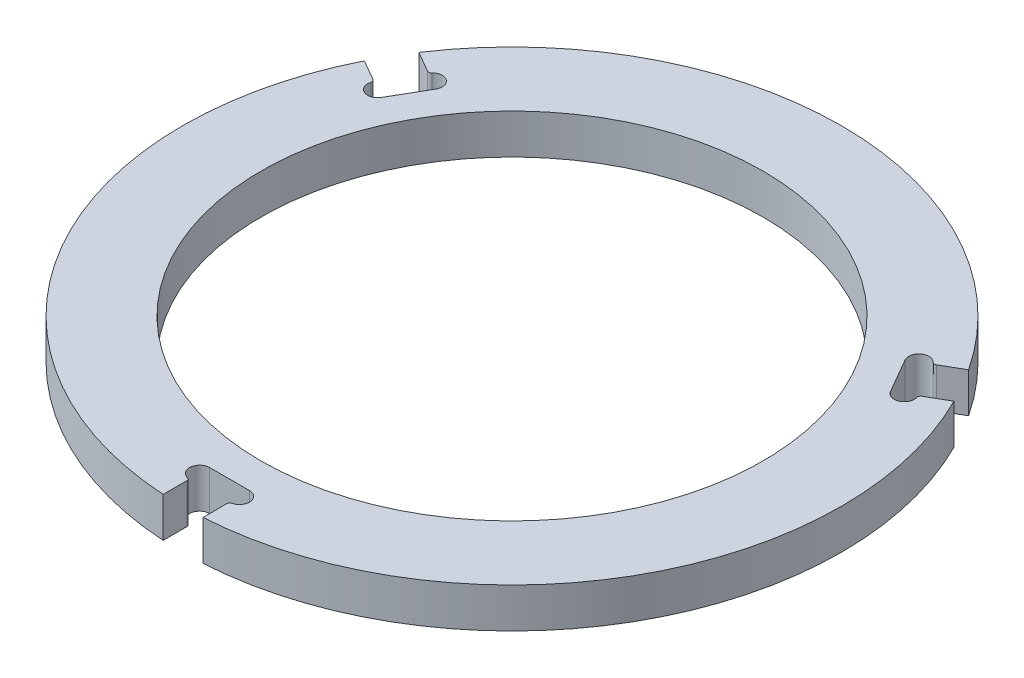
ISO-10303-21;
HEADER;
FILE_DESCRIPTION(('STEP AP214'),'2;1');
FILE_NAME('part.step','',(''),(''),'','','');
FILE_SCHEMA(('AUTOMOTIVE_DESIGN { 1 0 10303 214 1 1 1 1 }'));
ENDSEC;
DATA;
#1=APPLICATION_CONTEXT('core data for automotive mechanical design processes');
#2=APPLICATION_PROTOCOL_DEFINITION('international standard','automotive_design',2000,#1);
#3=PRODUCT_CONTEXT('',#1,'mechanical');
#4=PRODUCT('Part','Part','',(#3));
#5=PRODUCT_RELATED_PRODUCT_CATEGORY('part','',(#4));
#6=PRODUCT_DEFINITION_FORMATION('','',#4);
#7=PRODUCT_DEFINITION_CONTEXT('part definition',#1,'design');
#8=PRODUCT_DEFINITION('design','',#6,#7);
#9=PRODUCT_DEFINITION_SHAPE('','',#8);
#10=(LENGTH_UNIT() NAMED_UNIT(*) SI_UNIT(.MILLI.,.METRE.));
#11=(NAMED_UNIT(*) PLANE_ANGLE_UNIT() SI_UNIT($,.RADIAN.));
#12=(NAMED_UNIT(*) SI_UNIT($,.STERADIAN.) SOLID_ANGLE_UNIT());
#13=UNCERTAINTY_MEASURE_WITH_UNIT(LENGTH_MEASURE(1.E-05),#10,'distance_accuracy_value','');
#14=(GEOMETRIC_REPRESENTATION_CONTEXT(3) GLOBAL_UNCERTAINTY_ASSIGNED_CONTEXT((#13)) GLOBAL_UNIT_ASSIGNED_CONTEXT((#10,
#11,#12)) REPRESENTATION_CONTEXT('',''));
#15=CARTESIAN_POINT('',(0.,0.,0.));
#16=DIRECTION('',(0.,0.,1.));
#17=DIRECTION('',(1.,0.,0.));
#18=AXIS2_PLACEMENT_3D('',#15,#16,#17);
#19=CARTESIAN_POINT('',(0.,12.7,0.));
#20=DIRECTION('',(0.,-1.,0.));
#21=DIRECTION('',(0.,0.,-1.));
#22=AXIS2_PLACEMENT_3D('',#19,#20,#21);
#23=CYLINDRICAL_SURFACE('',#22,105.);
#24=CARTESIAN_POINT('',(0.,0.,0.));
#25=DIRECTION('',(0.,1.,0.));
#26=DIRECTION('',(0.,0.,1.));
#27=AXIS2_PLACEMENT_3D('',#24,#25,#26);
#28=CIRCLE('',#27,105.);
#29=CARTESIAN_POINT('',(87.5912278879097,0.,-57.9031674184433));
#30=VERTEX_POINT('',#29);
#31=CARTESIAN_POINT('',(-87.5912278879105,0.,-57.9031674184421));
#32=VERTEX_POINT('',#31);
#33=EDGE_CURVE('E319',#30,#32,#28,.T.);
#34=ORIENTED_EDGE('',*,*,#33,.T.);
#35=DIRECTION('',(0.,-1.,0.));
#36=VECTOR('',#35,1.);
#37=CARTESIAN_POINT('',(-87.5912278879105,12.7,-57.9031674184421));
#38=LINE('',#37,#36);
#39=CARTESIAN_POINT('',(-87.5912278879105,12.7,-57.9031674184421));
#40=VERTEX_POINT('',#39);
#41=EDGE_CURVE('E352',#32,#40,#38,.F.);
#42=ORIENTED_EDGE('',*,*,#41,.T.);
#43=CARTESIAN_POINT('',(0.,12.7,0.));
#44=DIRECTION('',(0.,1.,0.));
#45=DIRECTION('',(0.,0.,1.));
#46=AXIS2_PLACEMENT_3D('',#43,#44,#45);
#47=CIRCLE('',#46,105.);
#48=CARTESIAN_POINT('',(87.5912278879097,12.7,-57.9031674184433));
#49=VERTEX_POINT('',#48);
#50=EDGE_CURVE('E314',#49,#40,#47,.T.);
#51=ORIENTED_EDGE('',*,*,#50,.F.);
#52=DIRECTION('',(0.,-1.,0.));
#53=VECTOR('',#52,1.);
#54=CARTESIAN_POINT('',(87.5912278879097,12.7,-57.9031674184433));
#55=LINE('',#54,#53);
#56=EDGE_CURVE('E343',#49,#30,#55,.T.);
#57=ORIENTED_EDGE('',*,*,#56,.T.);
#58=EDGE_LOOP('',(#34,#42,#51,#57));
#59=FACE_BOUND('',#58,.T.);
#60=ADVANCED_FACE('F37',(#59),#23,.T.);
#61=CARTESIAN_POINT('',(6.35000000000001,0.,104.807812208823));
#62=VERTEX_POINT('',#61);
#63=CARTESIAN_POINT('',(93.9412278879097,0.,-46.904644790381));
#64=VERTEX_POINT('',#63);
#65=EDGE_CURVE('E316',#62,#64,#28,.T.);
#66=ORIENTED_EDGE('',*,*,#65,.T.);
#67=DIRECTION('',(0.,-1.,0.));
#68=VECTOR('',#67,1.);
#69=CARTESIAN_POINT('',(93.9412278879097,12.7,-46.904644790381));
#70=LINE('',#69,#68);
#71=CARTESIAN_POINT('',(93.9412278879097,12.7,-46.904644790381));
#72=VERTEX_POINT('',#71);
#73=EDGE_CURVE('E346',#64,#72,#70,.F.);
#74=ORIENTED_EDGE('',*,*,#73,.T.);
#75=CARTESIAN_POINT('',(6.35000000000001,12.7,104.807812208823));
#76=VERTEX_POINT('',#75);
#77=EDGE_CURVE('E310',#76,#72,#47,.T.);
#78=ORIENTED_EDGE('',*,*,#77,.F.);
#79=DIRECTION('',(0.,-1.,0.));
#80=VECTOR('',#79,1.);
#81=CARTESIAN_POINT('',(6.35000000000001,12.7,104.807812208823));
#82=LINE('',#81,#80);
#83=EDGE_CURVE('E313',#76,#62,#82,.T.);
#84=ORIENTED_EDGE('',*,*,#83,.T.);
#85=EDGE_LOOP('',(#66,#74,#78,#84));
#86=FACE_BOUND('',#85,.T.);
#87=ADVANCED_FACE('F437',(#86),#23,.T.);
#88=CARTESIAN_POINT('',(0.,12.7,0.));
#89=DIRECTION('',(0.,1.,0.));
#90=DIRECTION('',(0.,0.,1.));
#91=AXIS2_PLACEMENT_3D('',#88,#89,#90);
#92=PLANE('',#91);
#93=CARTESIAN_POINT('',(-83.8885676327101,12.7,-41.100738685968));
#94=DIRECTION('',(0.,1.,0.));
#95=DIRECTION('',(-0.866025403784443,0.,-0.499999999999992));
#96=AXIS2_PLACEMENT_3D('',#93,#94,#95);
#97=CIRCLE('',#96,3.19999999999999);
#98=CARTESIAN_POINT('',(-86.9611042776862,12.7,-41.9948967062748));
#99=VERTEX_POINT('',#98);
#100=CARTESIAN_POINT('',(-81.1172863405998,12.7,-39.5007386859681));
#101=VERTEX_POINT('',#100);
#102=EDGE_CURVE('E215',#99,#101,#97,.T.);
#103=ORIENTED_EDGE('',*,*,#102,.F.);
#104=CARTESIAN_POINT('',(-87.9212719792412,12.7,-42.2743210876207));
#105=DIRECTION('',(0.,1.,0.));
#106=DIRECTION('',(0.,0.,1.));
#107=AXIS2_PLACEMENT_3D('',#104,#105,#106);
#108=CIRCLE('',#107,1.);
#109=CARTESIAN_POINT('',(-87.4212719792412,12.7,-43.1403464914051));
#110=VERTEX_POINT('',#109);
#111=EDGE_CURVE('E377',#99,#110,#108,.T.);
#112=ORIENTED_EDGE('',*,*,#111,.T.);
#113=DIRECTION('',(0.866025403784444,0.,0.499999999999991));
#114=VECTOR('',#113,1.);
#115=CARTESIAN_POINT('',(-86.6598489248203,12.7,-42.700738685968));
#116=LINE('',#115,#114);
#117=CARTESIAN_POINT('',(-93.9412278879104,12.7,-46.9046447903797));
#118=VERTEX_POINT('',#117);
#119=EDGE_CURVE('E229',#118,#110,#116,.T.);
#120=ORIENTED_EDGE('',*,*,#119,.F.);
#121=CARTESIAN_POINT('',(-6.34999999999998,12.7,104.807812208823));
#122=VERTEX_POINT('',#121);
#123=EDGE_CURVE('E315',#118,#122,#47,.T.);
#124=ORIENTED_EDGE('',*,*,#123,.T.);
#125=DIRECTION('',(0.,0.,1.));
#126=VECTOR('',#125,1.);
#127=CARTESIAN_POINT('',(-6.34999999999998,12.7,96.4));
#128=LINE('',#127,#126);
#129=CARTESIAN_POINT('',(-6.34999999999998,12.7,97.2792156108742));
#130=VERTEX_POINT('',#129);
#131=EDGE_CURVE('E268',#130,#122,#128,.T.);
#132=ORIENTED_EDGE('',*,*,#131,.F.);
#133=CARTESIAN_POINT('',(-7.34999999999998,12.7,97.2792156108742));
#134=DIRECTION('',(0.,1.,0.));
#135=DIRECTION('',(0.,0.,1.));
#136=AXIS2_PLACEMENT_3D('',#133,#134,#135);
#137=CIRCLE('',#136,1.);
#138=CARTESIAN_POINT('',(-7.11190476190475,12.7,96.3079737987613));
#139=VERTEX_POINT('',#138);
#140=EDGE_CURVE('E328',#130,#139,#137,.T.);
#141=ORIENTED_EDGE('',*,*,#140,.T.);
#142=CARTESIAN_POINT('',(-6.34999999999998,12.7,93.2));
#143=DIRECTION('',(0.,1.,0.));
#144=DIRECTION('',(0.,0.,1.));
#145=AXIS2_PLACEMENT_3D('',#142,#143,#144);
#146=CIRCLE('',#145,3.19999999999999);
#147=CARTESIAN_POINT('',(-6.34999999999999,12.7,90.));
#148=VERTEX_POINT('',#147);
#149=EDGE_CURVE('E275',#148,#139,#146,.T.);
#150=ORIENTED_EDGE('',*,*,#149,.F.);
#151=DIRECTION('',(-1.,0.,0.));
#152=VECTOR('',#151,1.);
#153=CARTESIAN_POINT('',(-6.34999999999999,12.7,90.));
#154=LINE('',#153,#152);
#155=CARTESIAN_POINT('',(6.35000000000001,12.7,90.));
#156=VERTEX_POINT('',#155);
#157=EDGE_CURVE('E294',#156,#148,#154,.T.);
#158=ORIENTED_EDGE('',*,*,#157,.F.);
#159=CARTESIAN_POINT('',(6.35000000000001,12.7,93.2));
#160=DIRECTION('',(0.,1.,0.));
#161=DIRECTION('',(0.,0.,1.));
#162=AXIS2_PLACEMENT_3D('',#159,#160,#161);
#163=CIRCLE('',#162,3.19999999999999);
#164=CARTESIAN_POINT('',(7.11190476190477,12.7,96.3079737987613));
#165=VERTEX_POINT('',#164);
#166=EDGE_CURVE('E292',#165,#156,#163,.T.);
#167=ORIENTED_EDGE('',*,*,#166,.F.);
#168=CARTESIAN_POINT('',(7.35000000000001,12.7,97.2792156108742));
#169=DIRECTION('',(0.,1.,0.));
#170=DIRECTION('',(0.,0.,1.));
#171=AXIS2_PLACEMENT_3D('',#168,#169,#170);
#172=CIRCLE('',#171,1.);
#173=CARTESIAN_POINT('',(6.35000000000001,12.7,97.2792156108742));
#174=VERTEX_POINT('',#173);
#175=EDGE_CURVE('E330',#165,#174,#172,.T.);
#176=ORIENTED_EDGE('',*,*,#175,.T.);
#177=DIRECTION('',(0.,0.,-1.));
#178=VECTOR('',#177,1.);
#179=CARTESIAN_POINT('',(6.35000000000001,12.7,96.4));
#180=LINE('',#179,#178);
#181=EDGE_CURVE('E289',#76,#174,#180,.T.);
#182=ORIENTED_EDGE('',*,*,#181,.F.);
#183=ORIENTED_EDGE('',*,*,#77,.T.);
#184=DIRECTION('',(0.866025403784436,0.,-0.500000000000004));
#185=VECTOR('',#184,1.);
#186=CARTESIAN_POINT('',(86.6598489248197,12.7,-42.7007386859692));
#187=LINE('',#186,#185);
#188=CARTESIAN_POINT('',(87.4212719792406,12.7,-43.1403464914063));
#189=VERTEX_POINT('',#188);
#190=EDGE_CURVE('E238',#189,#72,#187,.T.);
#191=ORIENTED_EDGE('',*,*,#190,.F.);
#192=CARTESIAN_POINT('',(87.9212719792406,12.7,-42.2743210876219));
#193=DIRECTION('',(0.,1.,0.));
#194=DIRECTION('',(0.,0.,1.));
#195=AXIS2_PLACEMENT_3D('',#192,#193,#194);
#196=CIRCLE('',#195,1.);
#197=CARTESIAN_POINT('',(86.9611042776856,12.7,-41.994896706276));
#198=VERTEX_POINT('',#197);
#199=EDGE_CURVE('E358',#189,#198,#196,.T.);
#200=ORIENTED_EDGE('',*,*,#199,.T.);
#201=CARTESIAN_POINT('',(83.8885676327095,12.7,-41.1007386859692));
#202=DIRECTION('',(0.,1.,0.));
#203=DIRECTION('',(0.866025403784436,0.,-0.500000000000004));
#204=AXIS2_PLACEMENT_3D('',#201,#202,#203);
#205=CIRCLE('',#204,3.19999999999999);
#206=CARTESIAN_POINT('',(81.1172863405993,12.7,-39.5007386859692));
#207=VERTEX_POINT('',#206);
#208=EDGE_CURVE('E243',#207,#198,#205,.T.);
#209=ORIENTED_EDGE('',*,*,#208,.F.);
#210=DIRECTION('',(0.500000000000004,0.,0.866025403784436));
#211=VECTOR('',#210,1.);
#212=CARTESIAN_POINT('',(81.1172863405993,12.7,-39.5007386859692));
#213=LINE('',#212,#211);
#214=CARTESIAN_POINT('',(74.7672863405993,12.7,-50.4992613140315));
#215=VERTEX_POINT('',#214);
#216=EDGE_CURVE('E261',#215,#207,#213,.T.);
#217=ORIENTED_EDGE('',*,*,#216,.F.);
#218=CARTESIAN_POINT('',(77.5385676327094,12.7,-52.0992613140316));
#219=DIRECTION('',(0.,1.,0.));
#220=DIRECTION('',(0.866025403784436,0.,-0.500000000000004));
#221=AXIS2_PLACEMENT_3D('',#218,#219,#220);
#222=CIRCLE('',#221,3.19999999999999);
#223=CARTESIAN_POINT('',(79.8491995157808,12.7,-54.3130770924861));
#224=VERTEX_POINT('',#223);
#225=EDGE_CURVE('E259',#224,#215,#222,.T.);
#226=ORIENTED_EDGE('',*,*,#225,.F.);
#227=CARTESIAN_POINT('',(80.5712719792406,12.7,-55.0048945232531));
#228=DIRECTION('',(0.,1.,0.));
#229=DIRECTION('',(0.,0.,1.));
#230=AXIS2_PLACEMENT_3D('',#227,#228,#229);
#231=CIRCLE('',#230,1.);
#232=CARTESIAN_POINT('',(81.0712719792406,12.7,-54.1388691194687));
#233=VERTEX_POINT('',#232);
#234=EDGE_CURVE('E360',#224,#233,#231,.T.);
#235=ORIENTED_EDGE('',*,*,#234,.T.);
#236=DIRECTION('',(-0.866025403784436,0.,0.500000000000005));
#237=VECTOR('',#236,1.);
#238=CARTESIAN_POINT('',(80.3098489248196,12.7,-53.6992613140316));
#239=LINE('',#238,#237);
#240=EDGE_CURVE('E256',#49,#233,#239,.T.);
#241=ORIENTED_EDGE('',*,*,#240,.F.);
#242=ORIENTED_EDGE('',*,*,#50,.T.);
#243=DIRECTION('',(-0.866025403784443,0.,-0.499999999999992));
#244=VECTOR('',#243,1.);
#245=CARTESIAN_POINT('',(-80.3098489248204,12.7,-53.6992613140304));
#246=LINE('',#245,#244);
#247=CARTESIAN_POINT('',(-81.0712719792413,12.7,-54.1388691194675));
#248=VERTEX_POINT('',#247);
#249=EDGE_CURVE('E227',#248,#40,#246,.T.);
#250=ORIENTED_EDGE('',*,*,#249,.F.);
#251=CARTESIAN_POINT('',(-80.5712719792413,12.7,-55.004894523252));
#252=DIRECTION('',(0.,1.,0.));
#253=DIRECTION('',(0.,0.,1.));
#254=AXIS2_PLACEMENT_3D('',#251,#252,#253);
#255=CIRCLE('',#254,1.);
#256=CARTESIAN_POINT('',(-79.8491995157815,12.7,-54.3130770924849));
#257=VERTEX_POINT('',#256);
#258=EDGE_CURVE('E375',#248,#257,#255,.T.);
#259=ORIENTED_EDGE('',*,*,#258,.T.);
#260=CARTESIAN_POINT('',(-77.5385676327102,12.7,-52.0992613140304));
#261=DIRECTION('',(0.,1.,0.));
#262=DIRECTION('',(-0.866025403784443,0.,-0.499999999999992));
#263=AXIS2_PLACEMENT_3D('',#260,#261,#262);
#264=CIRCLE('',#263,3.19999999999999);
#265=CARTESIAN_POINT('',(-74.7672863406,12.7,-50.4992613140305));
#266=VERTEX_POINT('',#265);
#267=EDGE_CURVE('E235',#266,#257,#264,.T.);
#268=ORIENTED_EDGE('',*,*,#267,.F.);
#269=DIRECTION('',(0.499999999999992,0.,-0.866025403784443));
#270=VECTOR('',#269,1.);
#271=CARTESIAN_POINT('',(-74.7672863406,12.7,-50.4992613140305));
#272=LINE('',#271,#270);
#273=EDGE_CURVE('E233',#101,#266,#272,.T.);
#274=ORIENTED_EDGE('',*,*,#273,.F.);
#275=EDGE_LOOP('',(#103,#112,#120,#124,#132,#141,#150,#158,#167,#176,#182,#183,#191,#200,#209,
#217,#226,#235,#241,#242,#250,#259,#268,#274));
#276=FACE_BOUND('',#275,.T.);
#277=CARTESIAN_POINT('',(0.,12.7,0.));
#278=DIRECTION('',(0.,1.,0.));
#279=DIRECTION('',(0.,0.,1.));
#280=AXIS2_PLACEMENT_3D('',#277,#278,#279);
#281=CIRCLE('',#280,80.);
#282=CARTESIAN_POINT('',(0.,12.7,80.));
#283=VERTEX_POINT('',#282);
#284=EDGE_CURVE('E304',#283,#283,#281,.T.);
#285=ORIENTED_EDGE('',*,*,#284,.F.);
#286=EDGE_LOOP('',(#285));
#287=FACE_BOUND('',#286,.T.);
#288=ADVANCED_FACE('F391',(#276,#287),#92,.T.);
#289=CARTESIAN_POINT('',(0.,0.,0.));
#290=DIRECTION('',(0.,1.,0.));
#291=DIRECTION('',(0.,0.,1.));
#292=AXIS2_PLACEMENT_3D('',#289,#290,#291);
#293=PLANE('',#292);
#294=DIRECTION('',(0.866025403784444,0.,0.499999999999991));
#295=VECTOR('',#294,1.);
#296=CARTESIAN_POINT('',(-86.6598489248203,0.,-42.700738685968));
#297=LINE('',#296,#295);
#298=CARTESIAN_POINT('',(-93.9412278879104,0.,-46.9046447903797));
#299=VERTEX_POINT('',#298);
#300=CARTESIAN_POINT('',(-87.4212719792412,0.,-43.1403464914051));
#301=VERTEX_POINT('',#300);
#302=EDGE_CURVE('E209',#299,#301,#297,.T.);
#303=ORIENTED_EDGE('',*,*,#302,.T.);
#304=CARTESIAN_POINT('',(-87.9212719792412,0.,-42.2743210876207));
#305=DIRECTION('',(0.,1.,0.));
#306=DIRECTION('',(0.,0.,1.));
#307=AXIS2_PLACEMENT_3D('',#304,#305,#306);
#308=CIRCLE('',#307,1.);
#309=CARTESIAN_POINT('',(-86.9611042776862,0.,-41.9948967062748));
#310=VERTEX_POINT('',#309);
#311=EDGE_CURVE('E205',#301,#310,#308,.F.);
#312=ORIENTED_EDGE('',*,*,#311,.T.);
#313=CARTESIAN_POINT('',(-83.8885676327101,0.,-41.100738685968));
#314=DIRECTION('',(0.,1.,0.));
#315=DIRECTION('',(-0.866025403784443,0.,-0.499999999999992));
#316=AXIS2_PLACEMENT_3D('',#313,#314,#315);
#317=CIRCLE('',#316,3.19999999999999);
#318=CARTESIAN_POINT('',(-81.1172863405998,0.,-39.5007386859681));
#319=VERTEX_POINT('',#318);
#320=EDGE_CURVE('E197',#310,#319,#317,.T.);
#321=ORIENTED_EDGE('',*,*,#320,.T.);
#322=DIRECTION('',(0.499999999999992,0.,-0.866025403784443));
#323=VECTOR('',#322,1.);
#324=CARTESIAN_POINT('',(-74.7672863406,0.,-50.4992613140305));
#325=LINE('',#324,#323);
#326=CARTESIAN_POINT('',(-74.7672863406,0.,-50.4992613140305));
#327=VERTEX_POINT('',#326);
#328=EDGE_CURVE('E203',#319,#327,#325,.T.);
#329=ORIENTED_EDGE('',*,*,#328,.T.);
#330=CARTESIAN_POINT('',(-77.5385676327102,0.,-52.0992613140304));
#331=DIRECTION('',(0.,1.,0.));
#332=DIRECTION('',(-0.866025403784443,0.,-0.499999999999992));
#333=AXIS2_PLACEMENT_3D('',#330,#331,#332);
#334=CIRCLE('',#333,3.19999999999999);
#335=CARTESIAN_POINT('',(-79.8491995157815,0.,-54.3130770924849));
#336=VERTEX_POINT('',#335);
#337=EDGE_CURVE('E220',#327,#336,#334,.T.);
#338=ORIENTED_EDGE('',*,*,#337,.T.);
#339=CARTESIAN_POINT('',(-80.5712719792413,0.,-55.004894523252));
#340=DIRECTION('',(0.,1.,0.));
#341=DIRECTION('',(0.,0.,1.));
#342=AXIS2_PLACEMENT_3D('',#339,#340,#341);
#343=CIRCLE('',#342,1.);
#344=CARTESIAN_POINT('',(-81.0712719792413,0.,-54.1388691194675));
#345=VERTEX_POINT('',#344);
#346=EDGE_CURVE('E52',#336,#345,#343,.F.);
#347=ORIENTED_EDGE('',*,*,#346,.T.);
#348=DIRECTION('',(-0.866025403784443,0.,-0.499999999999992));
#349=VECTOR('',#348,1.);
#350=CARTESIAN_POINT('',(-80.3098489248204,0.,-53.6992613140304));
#351=LINE('',#350,#349);
#352=EDGE_CURVE('E237',#345,#32,#351,.T.);
#353=ORIENTED_EDGE('',*,*,#352,.T.);
#354=ORIENTED_EDGE('',*,*,#33,.F.);
#355=DIRECTION('',(-0.866025403784436,0.,0.500000000000005));
#356=VECTOR('',#355,1.);
#357=CARTESIAN_POINT('',(80.3098489248196,0.,-53.6992613140316));
#358=LINE('',#357,#356);
#359=CARTESIAN_POINT('',(81.0712719792406,0.,-54.1388691194687));
#360=VERTEX_POINT('',#359);
#361=EDGE_CURVE('E242',#30,#360,#358,.T.);
#362=ORIENTED_EDGE('',*,*,#361,.T.);
#363=CARTESIAN_POINT('',(80.5712719792406,0.,-55.0048945232531));
#364=DIRECTION('',(0.,1.,0.));
#365=DIRECTION('',(0.,0.,1.));
#366=AXIS2_PLACEMENT_3D('',#363,#364,#365);
#367=CIRCLE('',#366,1.);
#368=CARTESIAN_POINT('',(79.8491995157808,0.,-54.3130770924861));
#369=VERTEX_POINT('',#368);
#370=EDGE_CURVE('E366',#360,#369,#367,.F.);
#371=ORIENTED_EDGE('',*,*,#370,.T.);
#372=CARTESIAN_POINT('',(77.5385676327094,0.,-52.0992613140316));
#373=DIRECTION('',(0.,1.,0.));
#374=DIRECTION('',(0.866025403784436,0.,-0.500000000000004));
#375=AXIS2_PLACEMENT_3D('',#372,#373,#374);
#376=CIRCLE('',#375,3.19999999999999);
#377=CARTESIAN_POINT('',(74.7672863405993,0.,-50.4992613140315));
#378=VERTEX_POINT('',#377);
#379=EDGE_CURVE('E246',#369,#378,#376,.T.);
#380=ORIENTED_EDGE('',*,*,#379,.T.);
#381=DIRECTION('',(0.500000000000004,0.,0.866025403784436));
#382=VECTOR('',#381,1.);
#383=CARTESIAN_POINT('',(81.1172863405993,0.,-39.5007386859692));
#384=LINE('',#383,#382);
#385=CARTESIAN_POINT('',(81.1172863405993,0.,-39.5007386859692));
#386=VERTEX_POINT('',#385);
#387=EDGE_CURVE('E248',#378,#386,#384,.T.);
#388=ORIENTED_EDGE('',*,*,#387,.T.);
#389=CARTESIAN_POINT('',(83.8885676327095,0.,-41.1007386859692));
#390=DIRECTION('',(0.,1.,0.));
#391=DIRECTION('',(0.866025403784436,0.,-0.500000000000004));
#392=AXIS2_PLACEMENT_3D('',#389,#390,#391);
#393=CIRCLE('',#392,3.19999999999999);
#394=CARTESIAN_POINT('',(86.9611042776856,0.,-41.994896706276));
#395=VERTEX_POINT('',#394);
#396=EDGE_CURVE('E251',#386,#395,#393,.T.);
#397=ORIENTED_EDGE('',*,*,#396,.T.);
#398=CARTESIAN_POINT('',(87.9212719792406,0.,-42.2743210876219));
#399=DIRECTION('',(0.,1.,0.));
#400=DIRECTION('',(0.,0.,1.));
#401=AXIS2_PLACEMENT_3D('',#398,#399,#400);
#402=CIRCLE('',#401,1.);
#403=CARTESIAN_POINT('',(87.4212719792406,0.,-43.1403464914063));
#404=VERTEX_POINT('',#403);
#405=EDGE_CURVE('E364',#395,#404,#402,.F.);
#406=ORIENTED_EDGE('',*,*,#405,.T.);
#407=DIRECTION('',(0.866025403784436,0.,-0.500000000000004));
#408=VECTOR('',#407,1.);
#409=CARTESIAN_POINT('',(86.6598489248197,0.,-42.7007386859692));
#410=LINE('',#409,#408);
#411=EDGE_CURVE('E240',#404,#64,#410,.T.);
#412=ORIENTED_EDGE('',*,*,#411,.T.);
#413=ORIENTED_EDGE('',*,*,#65,.F.);
#414=DIRECTION('',(0.,0.,-1.));
#415=VECTOR('',#414,1.);
#416=CARTESIAN_POINT('',(6.35000000000001,0.,96.4));
#417=LINE('',#416,#415);
#418=CARTESIAN_POINT('',(6.35000000000001,0.,97.2792156108742));
#419=VERTEX_POINT('',#418);
#420=EDGE_CURVE('E274',#62,#419,#417,.T.);
#421=ORIENTED_EDGE('',*,*,#420,.T.);
#422=CARTESIAN_POINT('',(7.35000000000001,0.,97.2792156108742));
#423=DIRECTION('',(0.,1.,0.));
#424=DIRECTION('',(0.,0.,1.));
#425=AXIS2_PLACEMENT_3D('',#422,#423,#424);
#426=CIRCLE('',#425,1.);
#427=CARTESIAN_POINT('',(7.11190476190477,0.,96.3079737987613));
#428=VERTEX_POINT('',#427);
#429=EDGE_CURVE('E336',#419,#428,#426,.F.);
#430=ORIENTED_EDGE('',*,*,#429,.T.);
#431=CARTESIAN_POINT('',(6.35000000000001,0.,93.2));
#432=DIRECTION('',(0.,1.,0.));
#433=DIRECTION('',(0.,0.,1.));
#434=AXIS2_PLACEMENT_3D('',#431,#432,#433);
#435=CIRCLE('',#434,3.19999999999999);
#436=CARTESIAN_POINT('',(6.35000000000001,0.,90.));
#437=VERTEX_POINT('',#436);
#438=EDGE_CURVE('E278',#428,#437,#435,.T.);
#439=ORIENTED_EDGE('',*,*,#438,.T.);
#440=DIRECTION('',(-1.,0.,0.));
#441=VECTOR('',#440,1.);
#442=CARTESIAN_POINT('',(-6.34999999999999,0.,90.));
#443=LINE('',#442,#441);
#444=CARTESIAN_POINT('',(-6.34999999999999,0.,90.));
#445=VERTEX_POINT('',#444);
#446=EDGE_CURVE('E280',#437,#445,#443,.T.);
#447=ORIENTED_EDGE('',*,*,#446,.T.);
#448=CARTESIAN_POINT('',(-6.34999999999998,0.,93.2));
#449=DIRECTION('',(0.,1.,0.));
#450=DIRECTION('',(0.,0.,1.));
#451=AXIS2_PLACEMENT_3D('',#448,#449,#450);
#452=CIRCLE('',#451,3.19999999999999);
#453=CARTESIAN_POINT('',(-7.11190476190475,0.,96.3079737987613));
#454=VERTEX_POINT('',#453);
#455=EDGE_CURVE('E283',#445,#454,#452,.T.);
#456=ORIENTED_EDGE('',*,*,#455,.T.);
#457=CARTESIAN_POINT('',(-7.34999999999998,0.,97.2792156108742));
#458=DIRECTION('',(0.,1.,0.));
#459=DIRECTION('',(0.,0.,1.));
#460=AXIS2_PLACEMENT_3D('',#457,#458,#459);
#461=CIRCLE('',#460,1.);
#462=CARTESIAN_POINT('',(-6.34999999999998,0.,97.2792156108742));
#463=VERTEX_POINT('',#462);
#464=EDGE_CURVE('E334',#454,#463,#461,.F.);
#465=ORIENTED_EDGE('',*,*,#464,.T.);
#466=DIRECTION('',(0.,0.,1.));
#467=VECTOR('',#466,1.);
#468=CARTESIAN_POINT('',(-6.34999999999998,0.,96.4));
#469=LINE('',#468,#467);
#470=CARTESIAN_POINT('',(-6.34999999999998,0.,104.807812208823));
#471=VERTEX_POINT('',#470);
#472=EDGE_CURVE('E271',#463,#471,#469,.T.);
#473=ORIENTED_EDGE('',*,*,#472,.T.);
#474=EDGE_CURVE('E307',#299,#471,#28,.T.);
#475=ORIENTED_EDGE('',*,*,#474,.F.);
#476=EDGE_LOOP('',(#303,#312,#321,#329,#338,#347,#353,#354,#362,#371,#380,#388,#397,#406,#412,
#413,#421,#430,#439,#447,#456,#465,#473,#475));
#477=FACE_BOUND('',#476,.T.);
#478=CARTESIAN_POINT('',(0.,0.,0.));
#479=DIRECTION('',(0.,1.,0.));
#480=DIRECTION('',(0.,0.,1.));
#481=AXIS2_PLACEMENT_3D('',#478,#479,#480);
#482=CIRCLE('',#481,80.);
#483=CARTESIAN_POINT('',(0.,0.,80.));
#484=VERTEX_POINT('',#483);
#485=EDGE_CURVE('E301',#484,#484,#482,.T.);
#486=ORIENTED_EDGE('',*,*,#485,.T.);
#487=EDGE_LOOP('',(#486));
#488=FACE_BOUND('',#487,.T.);
#489=ADVANCED_FACE('F200',(#477,#488),#293,.F.);
#490=ORIENTED_EDGE('',*,*,#123,.F.);
#491=DIRECTION('',(0.,-1.,0.));
#492=VECTOR('',#491,1.);
#493=CARTESIAN_POINT('',(-93.9412278879104,12.7,-46.9046447903797));
#494=LINE('',#493,#492);
#495=EDGE_CURVE('E349',#118,#299,#494,.T.);
#496=ORIENTED_EDGE('',*,*,#495,.T.);
#497=ORIENTED_EDGE('',*,*,#474,.T.);
#498=DIRECTION('',(0.,-1.,0.));
#499=VECTOR('',#498,1.);
#500=CARTESIAN_POINT('',(-6.34999999999998,12.7,104.807812208823));
#501=LINE('',#500,#499);
#502=EDGE_CURVE('E322',#471,#122,#501,.F.);
#503=ORIENTED_EDGE('',*,*,#502,.T.);
#504=EDGE_LOOP('',(#490,#496,#497,#503));
#505=FACE_BOUND('',#504,.T.);
#506=ADVANCED_FACE('F406',(#505),#23,.T.);
#507=CARTESIAN_POINT('',(0.,12.7,0.));
#508=DIRECTION('',(0.,-1.,0.));
#509=DIRECTION('',(0.,0.,-1.));
#510=AXIS2_PLACEMENT_3D('',#507,#508,#509);
#511=CYLINDRICAL_SURFACE('',#510,80.);
#512=ORIENTED_EDGE('',*,*,#284,.T.);
#513=EDGE_LOOP('',(#512));
#514=FACE_BOUND('',#513,.T.);
#515=ORIENTED_EDGE('',*,*,#485,.F.);
#516=EDGE_LOOP('',(#515));
#517=FACE_BOUND('',#516,.T.);
#518=ADVANCED_FACE('F477',(#514,#517),#511,.F.);
#519=CARTESIAN_POINT('',(-6.34999999999998,0.,96.4));
#520=DIRECTION('',(-1.,0.,0.));
#521=DIRECTION('',(0.,0.,1.));
#522=AXIS2_PLACEMENT_3D('',#519,#520,#521);
#523=PLANE('',#522);
#524=ORIENTED_EDGE('',*,*,#472,.F.);
#525=DIRECTION('',(0.,1.,0.));
#526=VECTOR('',#525,1.);
#527=CARTESIAN_POINT('',(-6.34999999999998,0.,97.2792156108742));
#528=LINE('',#527,#526);
#529=EDGE_CURVE('E338',#463,#130,#528,.T.);
#530=ORIENTED_EDGE('',*,*,#529,.T.);
#531=ORIENTED_EDGE('',*,*,#131,.T.);
#532=ORIENTED_EDGE('',*,*,#502,.F.);
#533=EDGE_LOOP('',(#524,#530,#531,#532));
#534=FACE_BOUND('',#533,.T.);
#535=ADVANCED_FACE('F404',(#534),#523,.F.);
#536=CARTESIAN_POINT('',(6.35000000000001,0.,96.4));
#537=DIRECTION('',(1.,0.,0.));
#538=DIRECTION('',(0.,0.,-1.));
#539=AXIS2_PLACEMENT_3D('',#536,#537,#538);
#540=PLANE('',#539);
#541=ORIENTED_EDGE('',*,*,#181,.T.);
#542=DIRECTION('',(0.,1.,0.));
#543=VECTOR('',#542,1.);
#544=CARTESIAN_POINT('',(6.35000000000001,0.,97.2792156108742));
#545=LINE('',#544,#543);
#546=EDGE_CURVE('E332',#174,#419,#545,.F.);
#547=ORIENTED_EDGE('',*,*,#546,.T.);
#548=ORIENTED_EDGE('',*,*,#420,.F.);
#549=ORIENTED_EDGE('',*,*,#83,.F.);
#550=EDGE_LOOP('',(#541,#547,#548,#549));
#551=FACE_BOUND('',#550,.T.);
#552=ADVANCED_FACE('F432',(#551),#540,.F.);
#553=CARTESIAN_POINT('',(-6.34999999999998,0.,93.2));
#554=DIRECTION('',(0.,1.,0.));
#555=DIRECTION('',(0.,0.,1.));
#556=AXIS2_PLACEMENT_3D('',#553,#554,#555);
#557=CYLINDRICAL_SURFACE('',#556,3.19999999999999);
#558=ORIENTED_EDGE('',*,*,#149,.T.);
#559=DIRECTION('',(0.,1.,0.));
#560=VECTOR('',#559,1.);
#561=CARTESIAN_POINT('',(-7.11190476190475,0.,96.3079737987613));
#562=LINE('',#561,#560);
#563=EDGE_CURVE('E341',#139,#454,#562,.F.);
#564=ORIENTED_EDGE('',*,*,#563,.T.);
#565=ORIENTED_EDGE('',*,*,#455,.F.);
#566=DIRECTION('',(0.,1.,0.));
#567=VECTOR('',#566,1.);
#568=CARTESIAN_POINT('',(-6.34999999999999,0.,90.));
#569=LINE('',#568,#567);
#570=EDGE_CURVE('E299',#445,#148,#569,.T.);
#571=ORIENTED_EDGE('',*,*,#570,.T.);
#572=EDGE_LOOP('',(#558,#564,#565,#571));
#573=FACE_BOUND('',#572,.T.);
#574=ADVANCED_FACE('F415',(#573),#557,.F.);
#575=CARTESIAN_POINT('',(-6.34999999999999,0.,90.));
#576=DIRECTION('',(0.,0.,-1.));
#577=DIRECTION('',(-1.,0.,0.));
#578=AXIS2_PLACEMENT_3D('',#575,#576,#577);
#579=PLANE('',#578);
#580=ORIENTED_EDGE('',*,*,#157,.T.);
#581=ORIENTED_EDGE('',*,*,#570,.F.);
#582=ORIENTED_EDGE('',*,*,#446,.F.);
#583=DIRECTION('',(0.,1.,0.));
#584=VECTOR('',#583,1.);
#585=CARTESIAN_POINT('',(6.35000000000001,0.,90.));
#586=LINE('',#585,#584);
#587=EDGE_CURVE('E286',#437,#156,#586,.T.);
#588=ORIENTED_EDGE('',*,*,#587,.T.);
#589=EDGE_LOOP('',(#580,#581,#582,#588));
#590=FACE_BOUND('',#589,.T.);
#591=ADVANCED_FACE('F419',(#590),#579,.F.);
#592=CARTESIAN_POINT('',(6.35000000000001,0.,93.2));
#593=DIRECTION('',(0.,1.,0.));
#594=DIRECTION('',(0.,0.,1.));
#595=AXIS2_PLACEMENT_3D('',#592,#593,#594);
#596=CYLINDRICAL_SURFACE('',#595,3.19999999999999);
#597=ORIENTED_EDGE('',*,*,#438,.F.);
#598=DIRECTION('',(0.,1.,0.));
#599=VECTOR('',#598,1.);
#600=CARTESIAN_POINT('',(7.11190476190477,0.,96.3079737987613));
#601=LINE('',#600,#599);
#602=EDGE_CURVE('E325',#428,#165,#601,.T.);
#603=ORIENTED_EDGE('',*,*,#602,.T.);
#604=ORIENTED_EDGE('',*,*,#166,.T.);
#605=ORIENTED_EDGE('',*,*,#587,.F.);
#606=EDGE_LOOP('',(#597,#603,#604,#605));
#607=FACE_BOUND('',#606,.T.);
#608=ADVANCED_FACE('F425',(#607),#596,.F.);
#609=CARTESIAN_POINT('',(7.35000000000001,0.,97.2792156108742));
#610=DIRECTION('',(0.,1.,0.));
#611=DIRECTION('',(0.,0.,1.));
#612=AXIS2_PLACEMENT_3D('',#609,#610,#611);
#613=CYLINDRICAL_SURFACE('',#612,1.);
#614=ORIENTED_EDGE('',*,*,#429,.F.);
#615=ORIENTED_EDGE('',*,*,#546,.F.);
#616=ORIENTED_EDGE('',*,*,#175,.F.);
#617=ORIENTED_EDGE('',*,*,#602,.F.);
#618=EDGE_LOOP('',(#614,#615,#616,#617));
#619=FACE_BOUND('',#618,.T.);
#620=ADVANCED_FACE('F429',(#619),#613,.T.);
#621=CARTESIAN_POINT('',(-7.34999999999998,0.,97.2792156108742));
#622=DIRECTION('',(0.,1.,0.));
#623=DIRECTION('',(0.,0.,1.));
#624=AXIS2_PLACEMENT_3D('',#621,#622,#623);
#625=CYLINDRICAL_SURFACE('',#624,1.);
#626=ORIENTED_EDGE('',*,*,#464,.F.);
#627=ORIENTED_EDGE('',*,*,#563,.F.);
#628=ORIENTED_EDGE('',*,*,#140,.F.);
#629=ORIENTED_EDGE('',*,*,#529,.F.);
#630=EDGE_LOOP('',(#626,#627,#628,#629));
#631=FACE_BOUND('',#630,.T.);
#632=ADVANCED_FACE('F410',(#631),#625,.T.);
#633=CARTESIAN_POINT('',(86.6598489248197,0.,-42.7007386859692));
#634=DIRECTION('',(0.500000000000004,0.,0.866025403784436));
#635=DIRECTION('',(0.866025403784436,0.,-0.500000000000004));
#636=AXIS2_PLACEMENT_3D('',#633,#634,#635);
#637=PLANE('',#636);
#638=ORIENTED_EDGE('',*,*,#411,.F.);
#639=DIRECTION('',(0.,1.,0.));
#640=VECTOR('',#639,1.);
#641=CARTESIAN_POINT('',(87.4212719792406,0.,-43.1403464914063));
#642=LINE('',#641,#640);
#643=EDGE_CURVE('E368',#404,#189,#642,.T.);
#644=ORIENTED_EDGE('',*,*,#643,.T.);
#645=ORIENTED_EDGE('',*,*,#190,.T.);
#646=ORIENTED_EDGE('',*,*,#73,.F.);
#647=EDGE_LOOP('',(#638,#644,#645,#646));
#648=FACE_BOUND('',#647,.T.);
#649=ADVANCED_FACE('F442',(#648),#637,.F.);
#650=CARTESIAN_POINT('',(80.3098489248196,0.,-53.6992613140316));
#651=DIRECTION('',(-0.500000000000005,0.,-0.866025403784436));
#652=DIRECTION('',(-0.866025403784436,0.,0.500000000000005));
#653=AXIS2_PLACEMENT_3D('',#650,#651,#652);
#654=PLANE('',#653);
#655=ORIENTED_EDGE('',*,*,#240,.T.);
#656=DIRECTION('',(0.,1.,0.));
#657=VECTOR('',#656,1.);
#658=CARTESIAN_POINT('',(81.0712719792406,0.,-54.1388691194687));
#659=LINE('',#658,#657);
#660=EDGE_CURVE('E362',#233,#360,#659,.F.);
#661=ORIENTED_EDGE('',*,*,#660,.T.);
#662=ORIENTED_EDGE('',*,*,#361,.F.);
#663=ORIENTED_EDGE('',*,*,#56,.F.);
#664=EDGE_LOOP('',(#655,#661,#662,#663));
#665=FACE_BOUND('',#664,.T.);
#666=ADVANCED_FACE('F466',(#665),#654,.F.);
#667=CARTESIAN_POINT('',(83.8885676327095,0.,-41.1007386859692));
#668=DIRECTION('',(0.,1.,0.));
#669=DIRECTION('',(0.,0.,1.));
#670=AXIS2_PLACEMENT_3D('',#667,#668,#669);
#671=CYLINDRICAL_SURFACE('',#670,3.19999999999999);
#672=ORIENTED_EDGE('',*,*,#208,.T.);
#673=DIRECTION('',(0.,1.,0.));
#674=VECTOR('',#673,1.);
#675=CARTESIAN_POINT('',(86.9611042776856,0.,-41.994896706276));
#676=LINE('',#675,#674);
#677=EDGE_CURVE('E371',#198,#395,#676,.F.);
#678=ORIENTED_EDGE('',*,*,#677,.T.);
#679=ORIENTED_EDGE('',*,*,#396,.F.);
#680=DIRECTION('',(0.,1.,0.));
#681=VECTOR('',#680,1.);
#682=CARTESIAN_POINT('',(81.1172863405993,0.,-39.5007386859692));
#683=LINE('',#682,#681);
#684=EDGE_CURVE('E266',#386,#207,#683,.T.);
#685=ORIENTED_EDGE('',*,*,#684,.T.);
#686=EDGE_LOOP('',(#672,#678,#679,#685));
#687=FACE_BOUND('',#686,.T.);
#688=ADVANCED_FACE('F450',(#687),#671,.F.);
#689=CARTESIAN_POINT('',(81.1172863405993,0.,-39.5007386859692));
#690=DIRECTION('',(-0.866025403784436,0.,0.500000000000004));
#691=DIRECTION('',(0.500000000000004,0.,0.866025403784436));
#692=AXIS2_PLACEMENT_3D('',#689,#690,#691);
#693=PLANE('',#692);
#694=ORIENTED_EDGE('',*,*,#216,.T.);
#695=ORIENTED_EDGE('',*,*,#684,.F.);
#696=ORIENTED_EDGE('',*,*,#387,.F.);
#697=DIRECTION('',(0.,1.,0.));
#698=VECTOR('',#697,1.);
#699=CARTESIAN_POINT('',(74.7672863405993,0.,-50.4992613140315));
#700=LINE('',#699,#698);
#701=EDGE_CURVE('E254',#378,#215,#700,.T.);
#702=ORIENTED_EDGE('',*,*,#701,.T.);
#703=EDGE_LOOP('',(#694,#695,#696,#702));
#704=FACE_BOUND('',#703,.T.);
#705=ADVANCED_FACE('F455',(#704),#693,.F.);
#706=CARTESIAN_POINT('',(77.5385676327094,0.,-52.0992613140316));
#707=DIRECTION('',(0.,1.,0.));
#708=DIRECTION('',(0.,0.,1.));
#709=AXIS2_PLACEMENT_3D('',#706,#707,#708);
#710=CYLINDRICAL_SURFACE('',#709,3.19999999999999);
#711=ORIENTED_EDGE('',*,*,#379,.F.);
#712=DIRECTION('',(0.,1.,0.));
#713=VECTOR('',#712,1.);
#714=CARTESIAN_POINT('',(79.8491995157808,0.,-54.3130770924861));
#715=LINE('',#714,#713);
#716=EDGE_CURVE('E355',#369,#224,#715,.T.);
#717=ORIENTED_EDGE('',*,*,#716,.T.);
#718=ORIENTED_EDGE('',*,*,#225,.T.);
#719=ORIENTED_EDGE('',*,*,#701,.F.);
#720=EDGE_LOOP('',(#711,#717,#718,#719));
#721=FACE_BOUND('',#720,.T.);
#722=ADVANCED_FACE('F459',(#721),#710,.F.);
#723=CARTESIAN_POINT('',(-80.3098489248204,0.,-53.6992613140304));
#724=DIRECTION('',(0.499999999999992,0.,-0.866025403784443));
#725=DIRECTION('',(-0.866025403784443,0.,-0.499999999999992));
#726=AXIS2_PLACEMENT_3D('',#723,#724,#725);
#727=PLANE('',#726);
#728=ORIENTED_EDGE('',*,*,#352,.F.);
#729=DIRECTION('',(0.,1.,0.));
#730=VECTOR('',#729,1.);
#731=CARTESIAN_POINT('',(-81.0712719792413,0.,-54.1388691194675));
#732=LINE('',#731,#730);
#733=EDGE_CURVE('E45',#345,#248,#732,.T.);
#734=ORIENTED_EDGE('',*,*,#733,.T.);
#735=ORIENTED_EDGE('',*,*,#249,.T.);
#736=ORIENTED_EDGE('',*,*,#41,.F.);
#737=EDGE_LOOP('',(#728,#734,#735,#736));
#738=FACE_BOUND('',#737,.T.);
#739=ADVANCED_FACE('F386',(#738),#727,.F.);
#740=CARTESIAN_POINT('',(-86.6598489248203,0.,-42.700738685968));
#741=DIRECTION('',(-0.499999999999991,0.,0.866025403784444));
#742=DIRECTION('',(0.866025403784444,0.,0.499999999999991));
#743=AXIS2_PLACEMENT_3D('',#740,#741,#742);
#744=PLANE('',#743);
#745=ORIENTED_EDGE('',*,*,#119,.T.);
#746=DIRECTION('',(0.,1.,0.));
#747=VECTOR('',#746,1.);
#748=CARTESIAN_POINT('',(-87.4212719792412,0.,-43.1403464914051));
#749=LINE('',#748,#747);
#750=EDGE_CURVE('E379',#110,#301,#749,.F.);
#751=ORIENTED_EDGE('',*,*,#750,.T.);
#752=ORIENTED_EDGE('',*,*,#302,.F.);
#753=ORIENTED_EDGE('',*,*,#495,.F.);
#754=EDGE_LOOP('',(#745,#751,#752,#753));
#755=FACE_BOUND('',#754,.T.);
#756=ADVANCED_FACE('F511',(#755),#744,.F.);
#757=CARTESIAN_POINT('',(-77.5385676327102,0.,-52.0992613140304));
#758=DIRECTION('',(0.,1.,0.));
#759=DIRECTION('',(0.,0.,1.));
#760=AXIS2_PLACEMENT_3D('',#757,#758,#759);
#761=CYLINDRICAL_SURFACE('',#760,3.19999999999999);
#762=ORIENTED_EDGE('',*,*,#267,.T.);
#763=DIRECTION('',(0.,1.,0.));
#764=VECTOR('',#763,1.);
#765=CARTESIAN_POINT('',(-79.8491995157815,0.,-54.3130770924849));
#766=LINE('',#765,#764);
#767=EDGE_CURVE('E11',#257,#336,#766,.F.);
#768=ORIENTED_EDGE('',*,*,#767,.T.);
#769=ORIENTED_EDGE('',*,*,#337,.F.);
#770=DIRECTION('',(0.,1.,0.));
#771=VECTOR('',#770,1.);
#772=CARTESIAN_POINT('',(-74.7672863406,0.,-50.4992613140305));
#773=LINE('',#772,#771);
#774=EDGE_CURVE('E219',#327,#266,#773,.T.);
#775=ORIENTED_EDGE('',*,*,#774,.T.);
#776=EDGE_LOOP('',(#762,#768,#769,#775));
#777=FACE_BOUND('',#776,.T.);
#778=ADVANCED_FACE('F514',(#777),#761,.F.);
#779=CARTESIAN_POINT('',(-74.7672863406,0.,-50.4992613140305));
#780=DIRECTION('',(0.866025403784443,0.,0.499999999999992));
#781=DIRECTION('',(0.499999999999992,0.,-0.866025403784443));
#782=AXIS2_PLACEMENT_3D('',#779,#780,#781);
#783=PLANE('',#782);
#784=ORIENTED_EDGE('',*,*,#273,.T.);
#785=ORIENTED_EDGE('',*,*,#774,.F.);
#786=ORIENTED_EDGE('',*,*,#328,.F.);
#787=DIRECTION('',(0.,1.,0.));
#788=VECTOR('',#787,1.);
#789=CARTESIAN_POINT('',(-81.1172863405998,0.,-39.5007386859681));
#790=LINE('',#789,#788);
#791=EDGE_CURVE('E212',#319,#101,#790,.T.);
#792=ORIENTED_EDGE('',*,*,#791,.T.);
#793=EDGE_LOOP('',(#784,#785,#786,#792));
#794=FACE_BOUND('',#793,.T.);
#795=ADVANCED_FACE('F222',(#794),#783,.F.);
#796=CARTESIAN_POINT('',(-83.8885676327101,0.,-41.100738685968));
#797=DIRECTION('',(0.,1.,0.));
#798=DIRECTION('',(0.,0.,1.));
#799=AXIS2_PLACEMENT_3D('',#796,#797,#798);
#800=CYLINDRICAL_SURFACE('',#799,3.19999999999999);
#801=ORIENTED_EDGE('',*,*,#320,.F.);
#802=DIRECTION('',(0.,1.,0.));
#803=VECTOR('',#802,1.);
#804=CARTESIAN_POINT('',(-86.9611042776862,0.,-41.9948967062748));
#805=LINE('',#804,#803);
#806=EDGE_CURVE('E373',#310,#99,#805,.T.);
#807=ORIENTED_EDGE('',*,*,#806,.T.);
#808=ORIENTED_EDGE('',*,*,#102,.T.);
#809=ORIENTED_EDGE('',*,*,#791,.F.);
#810=EDGE_LOOP('',(#801,#807,#808,#809));
#811=FACE_BOUND('',#810,.T.);
#812=ADVANCED_FACE('F213',(#811),#800,.F.);
#813=CARTESIAN_POINT('',(80.5712719792406,0.,-55.0048945232531));
#814=DIRECTION('',(0.,1.,0.));
#815=DIRECTION('',(0.,0.,1.));
#816=AXIS2_PLACEMENT_3D('',#813,#814,#815);
#817=CYLINDRICAL_SURFACE('',#816,1.);
#818=ORIENTED_EDGE('',*,*,#370,.F.);
#819=ORIENTED_EDGE('',*,*,#660,.F.);
#820=ORIENTED_EDGE('',*,*,#234,.F.);
#821=ORIENTED_EDGE('',*,*,#716,.F.);
#822=EDGE_LOOP('',(#818,#819,#820,#821));
#823=FACE_BOUND('',#822,.T.);
#824=ADVANCED_FACE('F463',(#823),#817,.T.);
#825=CARTESIAN_POINT('',(87.9212719792406,0.,-42.2743210876219));
#826=DIRECTION('',(0.,1.,0.));
#827=DIRECTION('',(0.,0.,1.));
#828=AXIS2_PLACEMENT_3D('',#825,#826,#827);
#829=CYLINDRICAL_SURFACE('',#828,1.);
#830=ORIENTED_EDGE('',*,*,#405,.F.);
#831=ORIENTED_EDGE('',*,*,#677,.F.);
#832=ORIENTED_EDGE('',*,*,#199,.F.);
#833=ORIENTED_EDGE('',*,*,#643,.F.);
#834=EDGE_LOOP('',(#830,#831,#832,#833));
#835=FACE_BOUND('',#834,.T.);
#836=ADVANCED_FACE('F446',(#835),#829,.T.);
#837=CARTESIAN_POINT('',(-87.9212719792412,0.,-42.2743210876207));
#838=DIRECTION('',(0.,1.,0.));
#839=DIRECTION('',(0.,0.,1.));
#840=AXIS2_PLACEMENT_3D('',#837,#838,#839);
#841=CYLINDRICAL_SURFACE('',#840,1.);
#842=ORIENTED_EDGE('',*,*,#311,.F.);
#843=ORIENTED_EDGE('',*,*,#750,.F.);
#844=ORIENTED_EDGE('',*,*,#111,.F.);
#845=ORIENTED_EDGE('',*,*,#806,.F.);
#846=EDGE_LOOP('',(#842,#843,#844,#845));
#847=FACE_BOUND('',#846,.T.);
#848=ADVANCED_FACE('F524',(#847),#841,.T.);
#849=CARTESIAN_POINT('',(-80.5712719792413,0.,-55.004894523252));
#850=DIRECTION('',(0.,1.,0.));
#851=DIRECTION('',(0.,0.,1.));
#852=AXIS2_PLACEMENT_3D('',#849,#850,#851);
#853=CYLINDRICAL_SURFACE('',#852,1.);
#854=ORIENTED_EDGE('',*,*,#346,.F.);
#855=ORIENTED_EDGE('',*,*,#767,.F.);
#856=ORIENTED_EDGE('',*,*,#258,.F.);
#857=ORIENTED_EDGE('',*,*,#733,.F.);
#858=EDGE_LOOP('',(#854,#855,#856,#857));
#859=FACE_BOUND('',#858,.T.);
#860=ADVANCED_FACE('F39',(#859),#853,.T.);
#861=CLOSED_SHELL('',(#60,#87,#288,#489,#506,#518,#535,#552,#574,#591,#608,#620,#632,#649,#666,
#688,#705,#722,#739,#756,#778,#795,#812,#824,#836,#848,#860));
#862=MANIFOLD_SOLID_BREP('B2',#861);
#863=ADVANCED_BREP_SHAPE_REPRESENTATION('',(#18,#862),#14);
#864=SHAPE_DEFINITION_REPRESENTATION(#9,#863);
ENDSEC;
END-ISO-10303-21;
